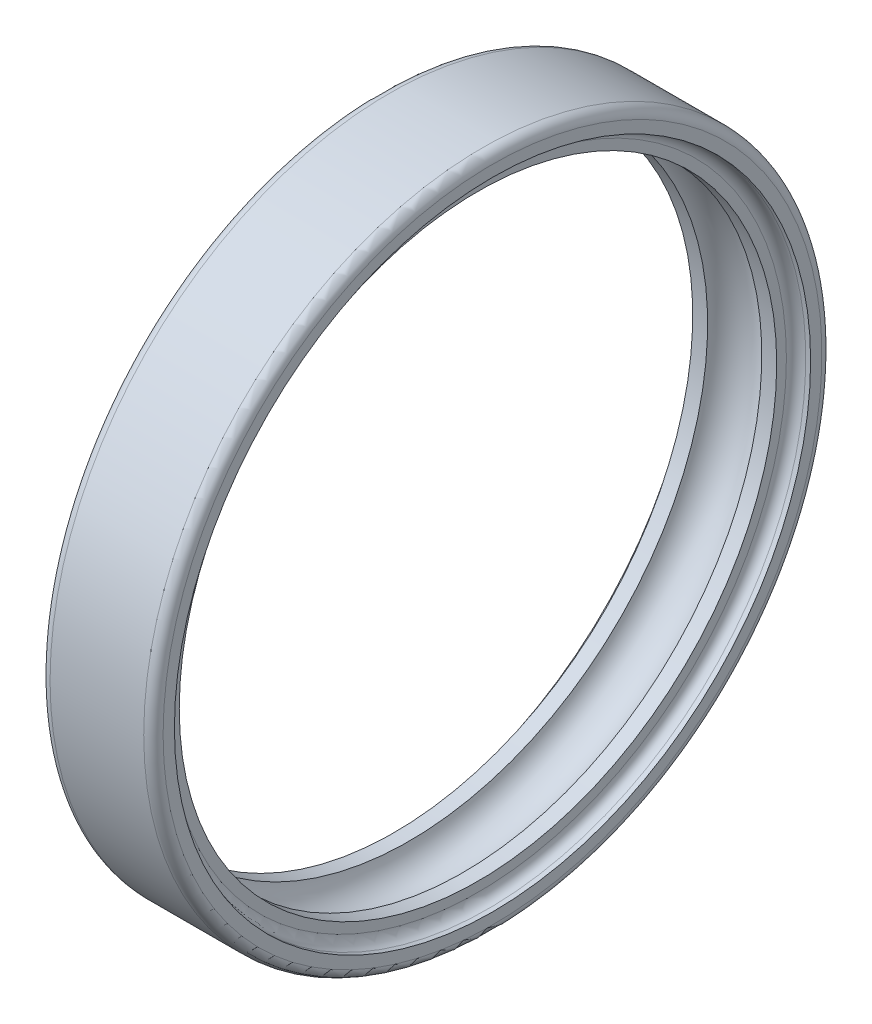
ISO-10303-21;
HEADER;
FILE_DESCRIPTION(('STEP AP214'),'2;1');
FILE_NAME('part.step','',(''),(''),'','','');
FILE_SCHEMA(('AUTOMOTIVE_DESIGN { 1 0 10303 214 1 1 1 1 }'));
ENDSEC;
DATA;
#1=APPLICATION_CONTEXT('core data for automotive mechanical design processes');
#2=APPLICATION_PROTOCOL_DEFINITION('international standard','automotive_design',2000,#1);
#3=PRODUCT_CONTEXT('',#1,'mechanical');
#4=PRODUCT('Part','Part','',(#3));
#5=PRODUCT_RELATED_PRODUCT_CATEGORY('part','',(#4));
#6=PRODUCT_DEFINITION_FORMATION('','',#4);
#7=PRODUCT_DEFINITION_CONTEXT('part definition',#1,'design');
#8=PRODUCT_DEFINITION('design','',#6,#7);
#9=PRODUCT_DEFINITION_SHAPE('','',#8);
#10=(LENGTH_UNIT() NAMED_UNIT(*) SI_UNIT(.MILLI.,.METRE.));
#11=(NAMED_UNIT(*) PLANE_ANGLE_UNIT() SI_UNIT($,.RADIAN.));
#12=(NAMED_UNIT(*) SI_UNIT($,.STERADIAN.) SOLID_ANGLE_UNIT());
#13=UNCERTAINTY_MEASURE_WITH_UNIT(LENGTH_MEASURE(1.E-05),#10,'distance_accuracy_value','');
#14=(GEOMETRIC_REPRESENTATION_CONTEXT(3) GLOBAL_UNCERTAINTY_ASSIGNED_CONTEXT((#13)) GLOBAL_UNIT_ASSIGNED_CONTEXT((#10,
#11,#12)) REPRESENTATION_CONTEXT('',''));
#15=CARTESIAN_POINT('',(0.,0.,0.));
#16=DIRECTION('',(0.,0.,1.));
#17=DIRECTION('',(1.,0.,0.));
#18=AXIS2_PLACEMENT_3D('',#15,#16,#17);
#19=CARTESIAN_POINT('',(0.,-20.7789574123528,-20.4));
#20=DIRECTION('',(-1.,0.,0.));
#21=DIRECTION('',(0.,0.,1.));
#22=AXIS2_PLACEMENT_3D('',#19,#20,#21);
#23=PLANE('',#22);
#24=CARTESIAN_POINT('',(0.,0.,0.));
#25=DIRECTION('',(-1.,0.,0.));
#26=DIRECTION('',(0.,0.,-1.));
#27=AXIS2_PLACEMENT_3D('',#24,#25,#26);
#28=CIRCLE('',#27,20.4);
#29=CARTESIAN_POINT('',(0.,0.,-20.4));
#30=VERTEX_POINT('',#29);
#31=EDGE_CURVE('E61',#30,#30,#28,.F.);
#32=ORIENTED_EDGE('',*,*,#31,.F.);
#33=EDGE_LOOP('',(#32));
#34=FACE_BOUND('',#33,.T.);
#35=CARTESIAN_POINT('',(0.,0.,0.));
#36=DIRECTION('',(1.,0.,0.));
#37=DIRECTION('',(0.,-1.16848861100226E-09,1.));
#38=AXIS2_PLACEMENT_3D('',#35,#36,#37);
#39=CIRCLE('',#38,19.7);
#40=CARTESIAN_POINT('',(0.,-2.30192256367445E-08,19.7));
#41=VERTEX_POINT('',#40);
#42=EDGE_CURVE('E58',#41,#41,#39,.T.);
#43=ORIENTED_EDGE('',*,*,#42,.T.);
#44=EDGE_LOOP('',(#43));
#45=FACE_BOUND('',#44,.T.);
#46=ADVANCED_FACE('F14',(#34,#45),#23,.T.);
#47=CARTESIAN_POINT('',(0.9,-19.4548081542459,-19.1));
#48=DIRECTION('',(-1.,0.,0.));
#49=DIRECTION('',(0.,0.,1.));
#50=AXIS2_PLACEMENT_3D('',#47,#48,#49);
#51=PLANE('',#50);
#52=CARTESIAN_POINT('',(0.9,0.,0.));
#53=DIRECTION('',(-1.,0.,0.));
#54=DIRECTION('',(0.,0.,-1.));
#55=AXIS2_PLACEMENT_3D('',#52,#53,#54);
#56=CIRCLE('',#55,19.1000000252881);
#57=CARTESIAN_POINT('',(0.9,0.,-19.1000000252881));
#58=VERTEX_POINT('',#57);
#59=EDGE_CURVE('E55',#58,#58,#56,.F.);
#60=ORIENTED_EDGE('',*,*,#59,.F.);
#61=EDGE_LOOP('',(#60));
#62=FACE_BOUND('',#61,.T.);
#63=CARTESIAN_POINT('',(0.9,0.,0.));
#64=DIRECTION('',(1.,0.,0.));
#65=DIRECTION('',(0.,-1.16858316416895E-09,1.));
#66=AXIS2_PLACEMENT_3D('',#63,#64,#65);
#67=CIRCLE('',#66,18.5);
#68=CARTESIAN_POINT('',(0.9,-2.16187885371255E-08,18.5));
#69=VERTEX_POINT('',#68);
#70=EDGE_CURVE('E52',#69,#69,#67,.T.);
#71=ORIENTED_EDGE('',*,*,#70,.T.);
#72=EDGE_LOOP('',(#71));
#73=FACE_BOUND('',#72,.T.);
#74=ADVANCED_FACE('F70',(#62,#73),#51,.T.);
#75=CARTESIAN_POINT('',(6.1,-19.4548081654872,19.1));
#76=DIRECTION('',(1.,0.,0.));
#77=DIRECTION('',(0.,0.,-1.));
#78=AXIS2_PLACEMENT_3D('',#75,#76,#77);
#79=PLANE('',#78);
#80=CARTESIAN_POINT('',(6.1,0.,0.));
#81=DIRECTION('',(1.,0.,0.));
#82=DIRECTION('',(0.,0.,1.));
#83=AXIS2_PLACEMENT_3D('',#80,#81,#82);
#84=CIRCLE('',#83,19.1000000720822);
#85=CARTESIAN_POINT('',(6.1,0.,19.1000000720822));
#86=VERTEX_POINT('',#85);
#87=EDGE_CURVE('E49',#86,#86,#84,.T.);
#88=ORIENTED_EDGE('',*,*,#87,.T.);
#89=EDGE_LOOP('',(#88));
#90=FACE_BOUND('',#89,.T.);
#91=CARTESIAN_POINT('',(6.1,0.,0.));
#92=DIRECTION('',(-1.,0.,0.));
#93=DIRECTION('',(0.,0.,-1.));
#94=AXIS2_PLACEMENT_3D('',#91,#92,#93);
#95=CIRCLE('',#94,18.5);
#96=CARTESIAN_POINT('',(6.1,0.,-18.5));
#97=VERTEX_POINT('',#96);
#98=EDGE_CURVE('E46',#97,#97,#95,.F.);
#99=ORIENTED_EDGE('',*,*,#98,.F.);
#100=EDGE_LOOP('',(#99));
#101=FACE_BOUND('',#100,.T.);
#102=ADVANCED_FACE('F120',(#90,#101),#79,.T.);
#103=CARTESIAN_POINT('',(7.,-20.7789574123528,20.4));
#104=DIRECTION('',(1.,0.,0.));
#105=DIRECTION('',(0.,0.,-1.));
#106=AXIS2_PLACEMENT_3D('',#103,#104,#105);
#107=PLANE('',#106);
#108=CARTESIAN_POINT('',(7.,0.,0.));
#109=DIRECTION('',(1.,0.,0.));
#110=DIRECTION('',(0.,0.,1.));
#111=AXIS2_PLACEMENT_3D('',#108,#109,#110);
#112=CIRCLE('',#111,20.4);
#113=CARTESIAN_POINT('',(7.,0.,20.4));
#114=VERTEX_POINT('',#113);
#115=EDGE_CURVE('E43',#114,#114,#112,.T.);
#116=ORIENTED_EDGE('',*,*,#115,.T.);
#117=EDGE_LOOP('',(#116));
#118=FACE_BOUND('',#117,.T.);
#119=CARTESIAN_POINT('',(7.,0.,0.));
#120=DIRECTION('',(-1.,0.,0.));
#121=DIRECTION('',(0.,0.,-1.));
#122=AXIS2_PLACEMENT_3D('',#119,#120,#121);
#123=CIRCLE('',#122,19.7);
#124=CARTESIAN_POINT('',(7.,0.,-19.7));
#125=VERTEX_POINT('',#124);
#126=EDGE_CURVE('E40',#125,#125,#123,.F.);
#127=ORIENTED_EDGE('',*,*,#126,.F.);
#128=EDGE_LOOP('',(#127));
#129=FACE_BOUND('',#128,.T.);
#130=ADVANCED_FACE('F87',(#118,#129),#107,.T.);
#131=CARTESIAN_POINT('',(0.599999999999879,0.,0.));
#132=DIRECTION('',(1.,0.,0.));
#133=DIRECTION('',(0.,1.92316507503928E-10,1.));
#134=AXIS2_PLACEMENT_3D('',#131,#132,#133);
#135=TOROIDAL_SURFACE('',#134,20.4,0.599999999999878);
#136=ORIENTED_EDGE('',*,*,#31,.T.);
#137=EDGE_LOOP('',(#136));
#138=FACE_BOUND('',#137,.T.);
#139=CARTESIAN_POINT('',(0.599999999999879,0.,0.));
#140=DIRECTION('',(-1.,0.,0.));
#141=DIRECTION('',(0.,0.,-1.));
#142=AXIS2_PLACEMENT_3D('',#139,#140,#141);
#143=CIRCLE('',#142,20.9999999999999);
#144=CARTESIAN_POINT('',(0.599999999999879,0.,-20.9999999999999));
#145=VERTEX_POINT('',#144);
#146=EDGE_CURVE('E37',#145,#145,#143,.F.);
#147=ORIENTED_EDGE('',*,*,#146,.F.);
#148=EDGE_LOOP('',(#147));
#149=FACE_BOUND('',#148,.T.);
#150=ADVANCED_FACE('F65',(#138,#149),#135,.T.);
#151=CARTESIAN_POINT('',(50.,0.,0.));
#152=DIRECTION('',(1.,0.,0.));
#153=DIRECTION('',(0.,0.,1.));
#154=AXIS2_PLACEMENT_3D('',#151,#152,#153);
#155=CYLINDRICAL_SURFACE('',#154,19.7);
#156=CARTESIAN_POINT('',(0.299999999999997,0.,0.));
#157=DIRECTION('',(1.,0.,0.));
#158=DIRECTION('',(0.,0.,1.));
#159=AXIS2_PLACEMENT_3D('',#156,#157,#158);
#160=CIRCLE('',#159,19.7);
#161=CARTESIAN_POINT('',(0.299999999999997,0.,19.7));
#162=VERTEX_POINT('',#161);
#163=EDGE_CURVE('E34',#162,#162,#160,.T.);
#164=ORIENTED_EDGE('',*,*,#163,.T.);
#165=EDGE_LOOP('',(#164));
#166=FACE_BOUND('',#165,.T.);
#167=ORIENTED_EDGE('',*,*,#42,.F.);
#168=EDGE_LOOP('',(#167));
#169=FACE_BOUND('',#168,.T.);
#170=ADVANCED_FACE('F74',(#166,#169),#155,.F.);
#171=CARTESIAN_POINT('',(0.300000000000125,0.,0.));
#172=DIRECTION('',(1.,0.,0.));
#173=DIRECTION('',(0.,1.16845834153431E-09,1.));
#174=AXIS2_PLACEMENT_3D('',#171,#172,#173);
#175=TOROIDAL_SURFACE('',#174,19.1,0.599999999999875);
#176=ORIENTED_EDGE('',*,*,#59,.T.);
#177=EDGE_LOOP('',(#176));
#178=FACE_BOUND('',#177,.T.);
#179=ORIENTED_EDGE('',*,*,#163,.F.);
#180=EDGE_LOOP('',(#179));
#181=FACE_BOUND('',#180,.T.);
#182=ADVANCED_FACE('F76',(#178,#181),#175,.F.);
#183=CARTESIAN_POINT('',(50.,0.,0.));
#184=DIRECTION('',(1.,0.,0.));
#185=DIRECTION('',(0.,0.,1.));
#186=AXIS2_PLACEMENT_3D('',#183,#184,#185);
#187=CYLINDRICAL_SURFACE('',#186,18.5);
#188=CARTESIAN_POINT('',(1.8229490168752,0.,0.));
#189=DIRECTION('',(1.,0.,0.));
#190=DIRECTION('',(0.,0.,1.));
#191=AXIS2_PLACEMENT_3D('',#188,#189,#190);
#192=CIRCLE('',#191,18.5);
#193=CARTESIAN_POINT('',(1.8229490168752,0.,18.5));
#194=VERTEX_POINT('',#193);
#195=EDGE_CURVE('E29',#194,#194,#192,.T.);
#196=ORIENTED_EDGE('',*,*,#195,.T.);
#197=EDGE_LOOP('',(#196));
#198=FACE_BOUND('',#197,.T.);
#199=ORIENTED_EDGE('',*,*,#70,.F.);
#200=EDGE_LOOP('',(#199));
#201=FACE_BOUND('',#200,.T.);
#202=ADVANCED_FACE('F84',(#198,#201),#187,.F.);
#203=CARTESIAN_POINT('',(3.5,0.,0.));
#204=DIRECTION('',(1.,0.,0.));
#205=DIRECTION('',(0.,0.,1.));
#206=AXIS2_PLACEMENT_3D('',#203,#204,#205);
#207=TOROIDAL_SURFACE('',#206,18.,1.74999999999994);
#208=ORIENTED_EDGE('',*,*,#195,.F.);
#209=EDGE_LOOP('',(#208));
#210=FACE_BOUND('',#209,.T.);
#211=CARTESIAN_POINT('',(5.17705098312479,0.,0.));
#212=DIRECTION('',(1.,0.,0.));
#213=DIRECTION('',(0.,0.,1.));
#214=AXIS2_PLACEMENT_3D('',#211,#212,#213);
#215=CIRCLE('',#214,18.5);
#216=CARTESIAN_POINT('',(5.17705098312479,0.,18.5));
#217=VERTEX_POINT('',#216);
#218=EDGE_CURVE('E25',#217,#217,#215,.T.);
#219=ORIENTED_EDGE('',*,*,#218,.T.);
#220=EDGE_LOOP('',(#219));
#221=FACE_BOUND('',#220,.T.);
#222=ADVANCED_FACE('F93',(#210,#221),#207,.F.);
#223=CARTESIAN_POINT('',(50.,0.,0.));
#224=DIRECTION('',(1.,0.,0.));
#225=DIRECTION('',(0.,0.,1.));
#226=AXIS2_PLACEMENT_3D('',#223,#224,#225);
#227=CYLINDRICAL_SURFACE('',#226,18.5);
#228=ORIENTED_EDGE('',*,*,#98,.T.);
#229=EDGE_LOOP('',(#228));
#230=FACE_BOUND('',#229,.T.);
#231=ORIENTED_EDGE('',*,*,#218,.F.);
#232=EDGE_LOOP('',(#231));
#233=FACE_BOUND('',#232,.T.);
#234=ADVANCED_FACE('F97',(#230,#233),#227,.F.);
#235=CARTESIAN_POINT('',(6.69999999999992,0.,0.));
#236=DIRECTION('',(1.,0.,0.));
#237=DIRECTION('',(0.,0.,1.));
#238=AXIS2_PLACEMENT_3D('',#235,#236,#237);
#239=TOROIDAL_SURFACE('',#238,19.1,0.599999999999924);
#240=ORIENTED_EDGE('',*,*,#87,.F.);
#241=EDGE_LOOP('',(#240));
#242=FACE_BOUND('',#241,.T.);
#243=CARTESIAN_POINT('',(6.69999999999992,0.,0.));
#244=DIRECTION('',(1.,0.,0.));
#245=DIRECTION('',(0.,0.,1.));
#246=AXIS2_PLACEMENT_3D('',#243,#244,#245);
#247=CIRCLE('',#246,19.6999999999999);
#248=CARTESIAN_POINT('',(6.69999999999992,0.,19.6999999999999));
#249=VERTEX_POINT('',#248);
#250=EDGE_CURVE('E21',#249,#249,#247,.T.);
#251=ORIENTED_EDGE('',*,*,#250,.T.);
#252=EDGE_LOOP('',(#251));
#253=FACE_BOUND('',#252,.T.);
#254=ADVANCED_FACE('F101',(#242,#253),#239,.F.);
#255=CARTESIAN_POINT('',(50.,0.,0.));
#256=DIRECTION('',(1.,0.,0.));
#257=DIRECTION('',(0.,0.,1.));
#258=AXIS2_PLACEMENT_3D('',#255,#256,#257);
#259=CYLINDRICAL_SURFACE('',#258,19.7);
#260=ORIENTED_EDGE('',*,*,#126,.T.);
#261=EDGE_LOOP('',(#260));
#262=FACE_BOUND('',#261,.T.);
#263=ORIENTED_EDGE('',*,*,#250,.F.);
#264=EDGE_LOOP('',(#263));
#265=FACE_BOUND('',#264,.T.);
#266=ADVANCED_FACE('F105',(#262,#265),#259,.F.);
#267=CARTESIAN_POINT('',(6.40000000000007,0.,0.));
#268=DIRECTION('',(1.,0.,0.));
#269=DIRECTION('',(0.,0.,1.));
#270=AXIS2_PLACEMENT_3D('',#267,#268,#269);
#271=TOROIDAL_SURFACE('',#270,20.4,0.59999999999993);
#272=CARTESIAN_POINT('',(6.40000000000007,0.,0.));
#273=DIRECTION('',(1.,0.,0.));
#274=DIRECTION('',(0.,0.,1.));
#275=AXIS2_PLACEMENT_3D('',#272,#273,#274);
#276=CIRCLE('',#275,20.9999999999999);
#277=CARTESIAN_POINT('',(6.40000000000007,0.,20.9999999999999));
#278=VERTEX_POINT('',#277);
#279=EDGE_CURVE('E10',#278,#278,#276,.T.);
#280=ORIENTED_EDGE('',*,*,#279,.T.);
#281=EDGE_LOOP('',(#280));
#282=FACE_BOUND('',#281,.T.);
#283=ORIENTED_EDGE('',*,*,#115,.F.);
#284=EDGE_LOOP('',(#283));
#285=FACE_BOUND('',#284,.T.);
#286=ADVANCED_FACE('F108',(#282,#285),#271,.T.);
#287=CARTESIAN_POINT('',(50.,0.,0.));
#288=DIRECTION('',(1.,0.,0.));
#289=DIRECTION('',(0.,1.92316507503928E-10,1.));
#290=AXIS2_PLACEMENT_3D('',#287,#288,#289);
#291=CYLINDRICAL_SURFACE('',#290,21.);
#292=ORIENTED_EDGE('',*,*,#146,.T.);
#293=EDGE_LOOP('',(#292));
#294=FACE_BOUND('',#293,.T.);
#295=ORIENTED_EDGE('',*,*,#279,.F.);
#296=EDGE_LOOP('',(#295));
#297=FACE_BOUND('',#296,.T.);
#298=ADVANCED_FACE('F16',(#294,#297),#291,.T.);
#299=CLOSED_SHELL('',(#46,#74,#102,#130,#150,#170,#182,#202,#222,#234,#254,#266,#286,#298));
#300=MANIFOLD_SOLID_BREP('B1',#299);
#301=ADVANCED_BREP_SHAPE_REPRESENTATION('',(#18,#300),#14);
#302=SHAPE_DEFINITION_REPRESENTATION(#9,#301);
ENDSEC;
END-ISO-10303-21;
